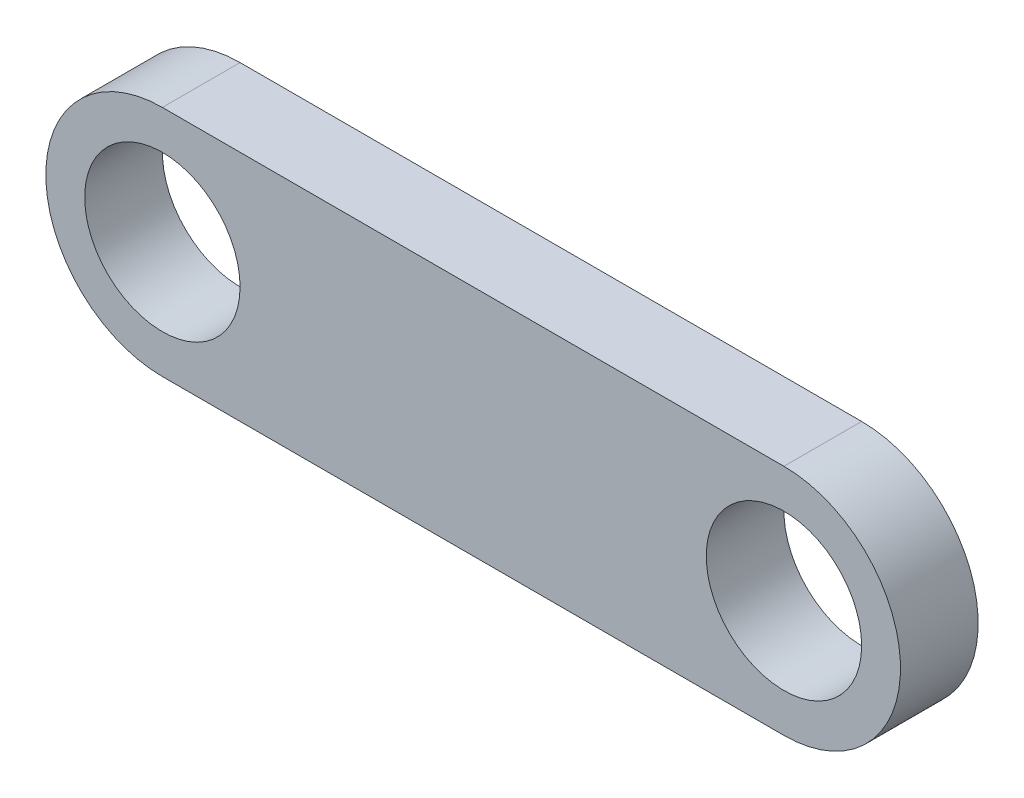
ISO-10303-21;
HEADER;
FILE_DESCRIPTION(('STEP AP214'),'2;1');
FILE_NAME('part.step','',(''),(''),'','','');
FILE_SCHEMA(('AUTOMOTIVE_DESIGN { 1 0 10303 214 1 1 1 1 }'));
ENDSEC;
DATA;
#1=APPLICATION_CONTEXT('core data for automotive mechanical design processes');
#2=APPLICATION_PROTOCOL_DEFINITION('international standard','automotive_design',2000,#1);
#3=PRODUCT_CONTEXT('',#1,'mechanical');
#4=PRODUCT('Part','Part','',(#3));
#5=PRODUCT_RELATED_PRODUCT_CATEGORY('part','',(#4));
#6=PRODUCT_DEFINITION_FORMATION('','',#4);
#7=PRODUCT_DEFINITION_CONTEXT('part definition',#1,'design');
#8=PRODUCT_DEFINITION('design','',#6,#7);
#9=PRODUCT_DEFINITION_SHAPE('','',#8);
#10=(LENGTH_UNIT() NAMED_UNIT(*) SI_UNIT(.MILLI.,.METRE.));
#11=(NAMED_UNIT(*) PLANE_ANGLE_UNIT() SI_UNIT($,.RADIAN.));
#12=(NAMED_UNIT(*) SI_UNIT($,.STERADIAN.) SOLID_ANGLE_UNIT());
#13=UNCERTAINTY_MEASURE_WITH_UNIT(LENGTH_MEASURE(1.E-05),#10,'distance_accuracy_value','');
#14=(GEOMETRIC_REPRESENTATION_CONTEXT(3) GLOBAL_UNCERTAINTY_ASSIGNED_CONTEXT((#13)) GLOBAL_UNIT_ASSIGNED_CONTEXT((#10,
#11,#12)) REPRESENTATION_CONTEXT('',''));
#15=CARTESIAN_POINT('',(0.,0.,0.));
#16=DIRECTION('',(0.,0.,1.));
#17=DIRECTION('',(1.,0.,0.));
#18=AXIS2_PLACEMENT_3D('',#15,#16,#17);
#19=CARTESIAN_POINT('',(0.,0.,10.));
#20=DIRECTION('',(0.,0.,1.));
#21=DIRECTION('',(1.,0.,0.));
#22=AXIS2_PLACEMENT_3D('',#19,#20,#21);
#23=PLANE('',#22);
#24=CARTESIAN_POINT('',(0.,0.,10.));
#25=DIRECTION('',(0.,0.,1.));
#26=DIRECTION('',(1.,0.,0.));
#27=AXIS2_PLACEMENT_3D('',#24,#25,#26);
#28=CIRCLE('',#27,10.);
#29=CARTESIAN_POINT('',(10.,0.,10.));
#30=VERTEX_POINT('',#29);
#31=EDGE_CURVE('E102',#30,#30,#28,.T.);
#32=ORIENTED_EDGE('',*,*,#31,.F.);
#33=EDGE_LOOP('',(#32));
#34=FACE_BOUND('',#33,.T.);
#35=CARTESIAN_POINT('',(0.,0.,10.));
#36=DIRECTION('',(0.,0.,1.));
#37=DIRECTION('',(1.,0.,0.));
#38=AXIS2_PLACEMENT_3D('',#35,#36,#37);
#39=CIRCLE('',#38,15.);
#40=CARTESIAN_POINT('',(0.,15.,10.));
#41=VERTEX_POINT('',#40);
#42=CARTESIAN_POINT('',(0.,-15.,10.));
#43=VERTEX_POINT('',#42);
#44=EDGE_CURVE('E87',#41,#43,#39,.T.);
#45=ORIENTED_EDGE('',*,*,#44,.T.);
#46=DIRECTION('',(1.,0.,0.));
#47=VECTOR('',#46,1.);
#48=CARTESIAN_POINT('',(0.,-15.,10.));
#49=LINE('',#48,#47);
#50=CARTESIAN_POINT('',(80.,-15.,10.));
#51=VERTEX_POINT('',#50);
#52=EDGE_CURVE('E82',#43,#51,#49,.T.);
#53=ORIENTED_EDGE('',*,*,#52,.T.);
#54=CARTESIAN_POINT('',(80.,0.,10.));
#55=DIRECTION('',(0.,0.,1.));
#56=DIRECTION('',(1.,0.,0.));
#57=AXIS2_PLACEMENT_3D('',#54,#55,#56);
#58=CIRCLE('',#57,15.);
#59=CARTESIAN_POINT('',(80.,15.,10.));
#60=VERTEX_POINT('',#59);
#61=EDGE_CURVE('E85',#51,#60,#58,.T.);
#62=ORIENTED_EDGE('',*,*,#61,.T.);
#63=DIRECTION('',(-1.,0.,0.));
#64=VECTOR('',#63,1.);
#65=CARTESIAN_POINT('',(0.,15.,10.));
#66=LINE('',#65,#64);
#67=EDGE_CURVE('E52',#60,#41,#66,.T.);
#68=ORIENTED_EDGE('',*,*,#67,.T.);
#69=EDGE_LOOP('',(#45,#53,#62,#68));
#70=FACE_BOUND('',#69,.T.);
#71=CARTESIAN_POINT('',(80.,0.,10.));
#72=DIRECTION('',(0.,0.,1.));
#73=DIRECTION('',(1.,0.,0.));
#74=AXIS2_PLACEMENT_3D('',#71,#72,#73);
#75=CIRCLE('',#74,10.);
#76=CARTESIAN_POINT('',(90.,0.,10.));
#77=VERTEX_POINT('',#76);
#78=EDGE_CURVE('E117',#77,#77,#75,.T.);
#79=ORIENTED_EDGE('',*,*,#78,.F.);
#80=EDGE_LOOP('',(#79));
#81=FACE_BOUND('',#80,.T.);
#82=ADVANCED_FACE('F35',(#34,#70,#81),#23,.T.);
#83=CARTESIAN_POINT('',(0.,0.,0.));
#84=DIRECTION('',(0.,0.,1.));
#85=DIRECTION('',(1.,0.,0.));
#86=AXIS2_PLACEMENT_3D('',#83,#84,#85);
#87=PLANE('',#86);
#88=CARTESIAN_POINT('',(0.,0.,0.));
#89=DIRECTION('',(0.,0.,1.));
#90=DIRECTION('',(1.,0.,0.));
#91=AXIS2_PLACEMENT_3D('',#88,#89,#90);
#92=CIRCLE('',#91,15.);
#93=CARTESIAN_POINT('',(0.,15.,0.));
#94=VERTEX_POINT('',#93);
#95=CARTESIAN_POINT('',(0.,-15.,0.));
#96=VERTEX_POINT('',#95);
#97=EDGE_CURVE('E99',#94,#96,#92,.T.);
#98=ORIENTED_EDGE('',*,*,#97,.F.);
#99=DIRECTION('',(-1.,0.,0.));
#100=VECTOR('',#99,1.);
#101=CARTESIAN_POINT('',(0.,15.,0.));
#102=LINE('',#101,#100);
#103=CARTESIAN_POINT('',(80.,15.,0.));
#104=VERTEX_POINT('',#103);
#105=EDGE_CURVE('E75',#104,#94,#102,.T.);
#106=ORIENTED_EDGE('',*,*,#105,.F.);
#107=CARTESIAN_POINT('',(80.,0.,0.));
#108=DIRECTION('',(0.,0.,1.));
#109=DIRECTION('',(1.,0.,0.));
#110=AXIS2_PLACEMENT_3D('',#107,#108,#109);
#111=CIRCLE('',#110,15.);
#112=CARTESIAN_POINT('',(80.,-15.,0.));
#113=VERTEX_POINT('',#112);
#114=EDGE_CURVE('E69',#113,#104,#111,.T.);
#115=ORIENTED_EDGE('',*,*,#114,.F.);
#116=DIRECTION('',(1.,0.,0.));
#117=VECTOR('',#116,1.);
#118=CARTESIAN_POINT('',(0.,-15.,0.));
#119=LINE('',#118,#117);
#120=EDGE_CURVE('E91',#96,#113,#119,.T.);
#121=ORIENTED_EDGE('',*,*,#120,.F.);
#122=EDGE_LOOP('',(#98,#106,#115,#121));
#123=FACE_BOUND('',#122,.T.);
#124=CARTESIAN_POINT('',(0.,0.,0.));
#125=DIRECTION('',(0.,0.,1.));
#126=DIRECTION('',(1.,0.,0.));
#127=AXIS2_PLACEMENT_3D('',#124,#125,#126);
#128=CIRCLE('',#127,10.);
#129=CARTESIAN_POINT('',(10.,0.,0.));
#130=VERTEX_POINT('',#129);
#131=EDGE_CURVE('E114',#130,#130,#128,.T.);
#132=ORIENTED_EDGE('',*,*,#131,.T.);
#133=EDGE_LOOP('',(#132));
#134=FACE_BOUND('',#133,.T.);
#135=CARTESIAN_POINT('',(80.,0.,0.));
#136=DIRECTION('',(0.,0.,1.));
#137=DIRECTION('',(1.,0.,0.));
#138=AXIS2_PLACEMENT_3D('',#135,#136,#137);
#139=CIRCLE('',#138,10.);
#140=CARTESIAN_POINT('',(90.,0.,0.));
#141=VERTEX_POINT('',#140);
#142=EDGE_CURVE('E120',#141,#141,#139,.T.);
#143=ORIENTED_EDGE('',*,*,#142,.T.);
#144=EDGE_LOOP('',(#143));
#145=FACE_BOUND('',#144,.T.);
#146=ADVANCED_FACE('F110',(#123,#134,#145),#87,.F.);
#147=CARTESIAN_POINT('',(0.,0.,10.));
#148=DIRECTION('',(0.,0.,-1.));
#149=DIRECTION('',(-1.,0.,0.));
#150=AXIS2_PLACEMENT_3D('',#147,#148,#149);
#151=CYLINDRICAL_SURFACE('',#150,15.);
#152=ORIENTED_EDGE('',*,*,#97,.T.);
#153=DIRECTION('',(0.,0.,-1.));
#154=VECTOR('',#153,1.);
#155=CARTESIAN_POINT('',(0.,-15.,10.));
#156=LINE('',#155,#154);
#157=EDGE_CURVE('E11',#43,#96,#156,.T.);
#158=ORIENTED_EDGE('',*,*,#157,.F.);
#159=ORIENTED_EDGE('',*,*,#44,.F.);
#160=DIRECTION('',(0.,0.,-1.));
#161=VECTOR('',#160,1.);
#162=CARTESIAN_POINT('',(0.,15.,10.));
#163=LINE('',#162,#161);
#164=EDGE_CURVE('E95',#41,#94,#163,.T.);
#165=ORIENTED_EDGE('',*,*,#164,.T.);
#166=EDGE_LOOP('',(#152,#158,#159,#165));
#167=FACE_BOUND('',#166,.T.);
#168=ADVANCED_FACE('F37',(#167),#151,.T.);
#169=CARTESIAN_POINT('',(0.,-15.,10.));
#170=DIRECTION('',(0.,1.,0.));
#171=DIRECTION('',(-1.,0.,0.));
#172=AXIS2_PLACEMENT_3D('',#169,#170,#171);
#173=PLANE('',#172);
#174=ORIENTED_EDGE('',*,*,#120,.T.);
#175=DIRECTION('',(0.,0.,-1.));
#176=VECTOR('',#175,1.);
#177=CARTESIAN_POINT('',(80.,-15.,10.));
#178=LINE('',#177,#176);
#179=EDGE_CURVE('E44',#51,#113,#178,.T.);
#180=ORIENTED_EDGE('',*,*,#179,.F.);
#181=ORIENTED_EDGE('',*,*,#52,.F.);
#182=ORIENTED_EDGE('',*,*,#157,.T.);
#183=EDGE_LOOP('',(#174,#180,#181,#182));
#184=FACE_BOUND('',#183,.T.);
#185=ADVANCED_FACE('F90',(#184),#173,.F.);
#186=CARTESIAN_POINT('',(80.,0.,10.));
#187=DIRECTION('',(0.,0.,-1.));
#188=DIRECTION('',(-1.,0.,0.));
#189=AXIS2_PLACEMENT_3D('',#186,#187,#188);
#190=CYLINDRICAL_SURFACE('',#189,15.);
#191=ORIENTED_EDGE('',*,*,#114,.T.);
#192=DIRECTION('',(0.,0.,-1.));
#193=VECTOR('',#192,1.);
#194=CARTESIAN_POINT('',(80.,15.,10.));
#195=LINE('',#194,#193);
#196=EDGE_CURVE('E92',#60,#104,#195,.T.);
#197=ORIENTED_EDGE('',*,*,#196,.F.);
#198=ORIENTED_EDGE('',*,*,#61,.F.);
#199=ORIENTED_EDGE('',*,*,#179,.T.);
#200=EDGE_LOOP('',(#191,#197,#198,#199));
#201=FACE_BOUND('',#200,.T.);
#202=ADVANCED_FACE('F93',(#201),#190,.T.);
#203=CARTESIAN_POINT('',(0.,15.,10.));
#204=DIRECTION('',(0.,-1.,0.));
#205=DIRECTION('',(1.,0.,0.));
#206=AXIS2_PLACEMENT_3D('',#203,#204,#205);
#207=PLANE('',#206);
#208=ORIENTED_EDGE('',*,*,#105,.T.);
#209=ORIENTED_EDGE('',*,*,#164,.F.);
#210=ORIENTED_EDGE('',*,*,#67,.F.);
#211=ORIENTED_EDGE('',*,*,#196,.T.);
#212=EDGE_LOOP('',(#208,#209,#210,#211));
#213=FACE_BOUND('',#212,.T.);
#214=ADVANCED_FACE('F107',(#213),#207,.F.);
#215=CARTESIAN_POINT('',(0.,0.,10.));
#216=DIRECTION('',(0.,0.,-1.));
#217=DIRECTION('',(-1.,0.,0.));
#218=AXIS2_PLACEMENT_3D('',#215,#216,#217);
#219=CYLINDRICAL_SURFACE('',#218,10.);
#220=ORIENTED_EDGE('',*,*,#31,.T.);
#221=EDGE_LOOP('',(#220));
#222=FACE_BOUND('',#221,.T.);
#223=ORIENTED_EDGE('',*,*,#131,.F.);
#224=EDGE_LOOP('',(#223));
#225=FACE_BOUND('',#224,.T.);
#226=ADVANCED_FACE('F137',(#222,#225),#219,.F.);
#227=CARTESIAN_POINT('',(80.,0.,10.));
#228=DIRECTION('',(0.,0.,-1.));
#229=DIRECTION('',(-1.,0.,0.));
#230=AXIS2_PLACEMENT_3D('',#227,#228,#229);
#231=CYLINDRICAL_SURFACE('',#230,10.);
#232=ORIENTED_EDGE('',*,*,#78,.T.);
#233=EDGE_LOOP('',(#232));
#234=FACE_BOUND('',#233,.T.);
#235=ORIENTED_EDGE('',*,*,#142,.F.);
#236=EDGE_LOOP('',(#235));
#237=FACE_BOUND('',#236,.T.);
#238=ADVANCED_FACE('F126',(#234,#237),#231,.F.);
#239=CLOSED_SHELL('',(#82,#146,#168,#185,#202,#214,#226,#238));
#240=MANIFOLD_SOLID_BREP('B2',#239);
#241=ADVANCED_BREP_SHAPE_REPRESENTATION('',(#18,#240),#14);
#242=SHAPE_DEFINITION_REPRESENTATION(#9,#241);
ENDSEC;
END-ISO-10303-21;
